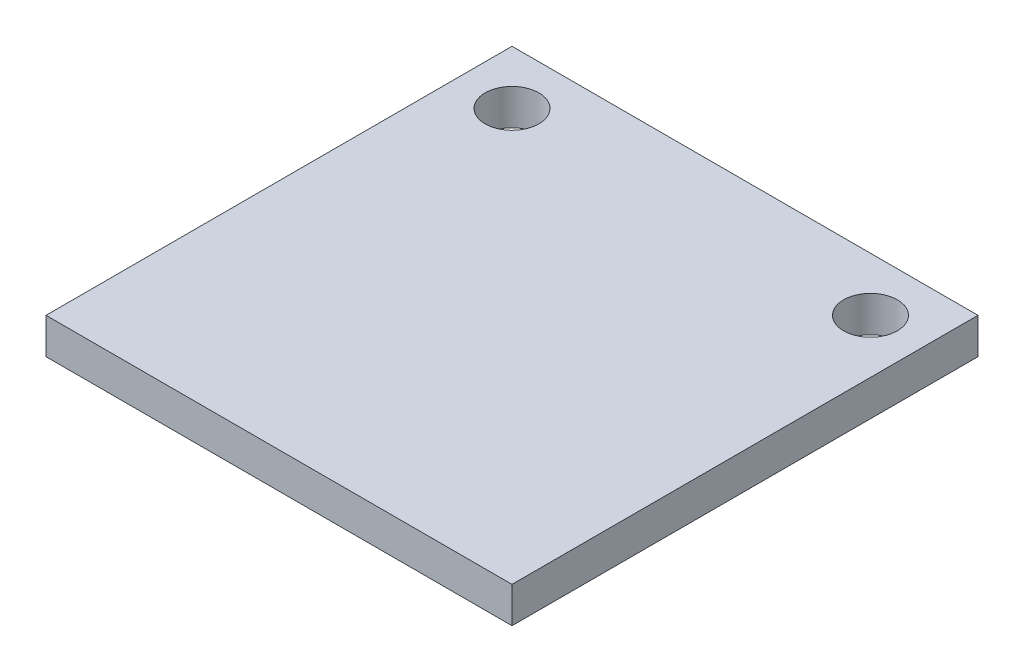
ISO-10303-21;
HEADER;
FILE_DESCRIPTION(('STEP AP214'),'2;1');
FILE_NAME('part.step','',(''),(''),'','','');
FILE_SCHEMA(('AUTOMOTIVE_DESIGN { 1 0 10303 214 1 1 1 1 }'));
ENDSEC;
DATA;
#1=APPLICATION_CONTEXT('core data for automotive mechanical design processes');
#2=APPLICATION_PROTOCOL_DEFINITION('international standard','automotive_design',2000,#1);
#3=PRODUCT_CONTEXT('',#1,'mechanical');
#4=PRODUCT('Part','Part','',(#3));
#5=PRODUCT_RELATED_PRODUCT_CATEGORY('part','',(#4));
#6=PRODUCT_DEFINITION_FORMATION('','',#4);
#7=PRODUCT_DEFINITION_CONTEXT('part definition',#1,'design');
#8=PRODUCT_DEFINITION('design','',#6,#7);
#9=PRODUCT_DEFINITION_SHAPE('','',#8);
#10=(LENGTH_UNIT() NAMED_UNIT(*) SI_UNIT(.MILLI.,.METRE.));
#11=(NAMED_UNIT(*) PLANE_ANGLE_UNIT() SI_UNIT($,.RADIAN.));
#12=(NAMED_UNIT(*) SI_UNIT($,.STERADIAN.) SOLID_ANGLE_UNIT());
#13=UNCERTAINTY_MEASURE_WITH_UNIT(LENGTH_MEASURE(1.E-05),#10,'distance_accuracy_value','');
#14=(GEOMETRIC_REPRESENTATION_CONTEXT(3) GLOBAL_UNCERTAINTY_ASSIGNED_CONTEXT((#13)) GLOBAL_UNIT_ASSIGNED_CONTEXT((#10,
#11,#12)) REPRESENTATION_CONTEXT('',''));
#15=CARTESIAN_POINT('',(0.,0.,0.));
#16=DIRECTION('',(0.,0.,1.));
#17=DIRECTION('',(1.,0.,0.));
#18=AXIS2_PLACEMENT_3D('',#15,#16,#17);
#19=CARTESIAN_POINT('',(0.,2.,0.));
#20=DIRECTION('',(0.,-1.,0.));
#21=DIRECTION('',(0.,0.,-1.));
#22=AXIS2_PLACEMENT_3D('',#19,#20,#21);
#23=PLANE('',#22);
#24=DIRECTION('',(0.,0.,-1.));
#25=VECTOR('',#24,1.);
#26=CARTESIAN_POINT('',(13.,2.,13.));
#27=LINE('',#26,#25);
#28=CARTESIAN_POINT('',(13.,2.,13.));
#29=VERTEX_POINT('',#28);
#30=CARTESIAN_POINT('',(13.,2.,-13.));
#31=VERTEX_POINT('',#30);
#32=EDGE_CURVE('E87',#29,#31,#27,.T.);
#33=ORIENTED_EDGE('',*,*,#32,.T.);
#34=DIRECTION('',(-1.,0.,0.));
#35=VECTOR('',#34,1.);
#36=CARTESIAN_POINT('',(-13.,2.,-13.));
#37=LINE('',#36,#35);
#38=CARTESIAN_POINT('',(-13.,2.,-13.));
#39=VERTEX_POINT('',#38);
#40=EDGE_CURVE('E82',#31,#39,#37,.T.);
#41=ORIENTED_EDGE('',*,*,#40,.T.);
#42=DIRECTION('',(0.,0.,1.));
#43=VECTOR('',#42,1.);
#44=CARTESIAN_POINT('',(-13.,2.,13.));
#45=LINE('',#44,#43);
#46=CARTESIAN_POINT('',(-13.,2.,13.));
#47=VERTEX_POINT('',#46);
#48=EDGE_CURVE('E85',#39,#47,#45,.T.);
#49=ORIENTED_EDGE('',*,*,#48,.T.);
#50=DIRECTION('',(1.,0.,0.));
#51=VECTOR('',#50,1.);
#52=CARTESIAN_POINT('',(-13.,2.,13.));
#53=LINE('',#52,#51);
#54=EDGE_CURVE('E52',#47,#29,#53,.T.);
#55=ORIENTED_EDGE('',*,*,#54,.T.);
#56=EDGE_LOOP('',(#33,#41,#49,#55));
#57=FACE_BOUND('',#56,.T.);
#58=CARTESIAN_POINT('',(-10.,2.,-10.));
#59=DIRECTION('',(0.,1.,0.));
#60=DIRECTION('',(0.,0.,1.));
#61=AXIS2_PLACEMENT_3D('',#58,#59,#60);
#62=CIRCLE('',#61,1.5);
#63=CARTESIAN_POINT('',(-10.,2.,-8.5));
#64=VERTEX_POINT('',#63);
#65=EDGE_CURVE('E102',#64,#64,#62,.T.);
#66=ORIENTED_EDGE('',*,*,#65,.F.);
#67=EDGE_LOOP('',(#66));
#68=FACE_BOUND('',#67,.T.);
#69=CARTESIAN_POINT('',(9.99999999999999,2.,-10.));
#70=DIRECTION('',(0.,1.,0.));
#71=DIRECTION('',(0.,0.,1.));
#72=AXIS2_PLACEMENT_3D('',#69,#70,#71);
#73=CIRCLE('',#72,1.5);
#74=CARTESIAN_POINT('',(9.99999999999999,2.,-8.49999999999999));
#75=VERTEX_POINT('',#74);
#76=EDGE_CURVE('E117',#75,#75,#73,.T.);
#77=ORIENTED_EDGE('',*,*,#76,.F.);
#78=EDGE_LOOP('',(#77));
#79=FACE_BOUND('',#78,.T.);
#80=ADVANCED_FACE('F35',(#57,#68,#79),#23,.F.);
#81=CARTESIAN_POINT('',(0.,0.,0.));
#82=DIRECTION('',(0.,-1.,0.));
#83=DIRECTION('',(0.,0.,-1.));
#84=AXIS2_PLACEMENT_3D('',#81,#82,#83);
#85=PLANE('',#84);
#86=CARTESIAN_POINT('',(-10.,0.,-10.));
#87=DIRECTION('',(0.,1.,0.));
#88=DIRECTION('',(0.,0.,1.));
#89=AXIS2_PLACEMENT_3D('',#86,#87,#88);
#90=CIRCLE('',#89,1.5);
#91=CARTESIAN_POINT('',(-10.,0.,-8.5));
#92=VERTEX_POINT('',#91);
#93=EDGE_CURVE('E114',#92,#92,#90,.T.);
#94=ORIENTED_EDGE('',*,*,#93,.T.);
#95=EDGE_LOOP('',(#94));
#96=FACE_BOUND('',#95,.T.);
#97=DIRECTION('',(0.,0.,-1.));
#98=VECTOR('',#97,1.);
#99=CARTESIAN_POINT('',(13.,0.,13.));
#100=LINE('',#99,#98);
#101=CARTESIAN_POINT('',(13.,0.,13.));
#102=VERTEX_POINT('',#101);
#103=CARTESIAN_POINT('',(13.,0.,-13.));
#104=VERTEX_POINT('',#103);
#105=EDGE_CURVE('E99',#102,#104,#100,.T.);
#106=ORIENTED_EDGE('',*,*,#105,.F.);
#107=DIRECTION('',(1.,0.,0.));
#108=VECTOR('',#107,1.);
#109=CARTESIAN_POINT('',(-13.,0.,13.));
#110=LINE('',#109,#108);
#111=CARTESIAN_POINT('',(-13.,0.,13.));
#112=VERTEX_POINT('',#111);
#113=EDGE_CURVE('E75',#112,#102,#110,.T.);
#114=ORIENTED_EDGE('',*,*,#113,.F.);
#115=DIRECTION('',(0.,0.,1.));
#116=VECTOR('',#115,1.);
#117=CARTESIAN_POINT('',(-13.,0.,13.));
#118=LINE('',#117,#116);
#119=CARTESIAN_POINT('',(-13.,0.,-13.));
#120=VERTEX_POINT('',#119);
#121=EDGE_CURVE('E69',#120,#112,#118,.T.);
#122=ORIENTED_EDGE('',*,*,#121,.F.);
#123=DIRECTION('',(-1.,0.,0.));
#124=VECTOR('',#123,1.);
#125=CARTESIAN_POINT('',(-13.,0.,-13.));
#126=LINE('',#125,#124);
#127=EDGE_CURVE('E91',#104,#120,#126,.T.);
#128=ORIENTED_EDGE('',*,*,#127,.F.);
#129=EDGE_LOOP('',(#106,#114,#122,#128));
#130=FACE_BOUND('',#129,.T.);
#131=CARTESIAN_POINT('',(9.99999999999999,0.,-10.));
#132=DIRECTION('',(0.,1.,0.));
#133=DIRECTION('',(0.,0.,1.));
#134=AXIS2_PLACEMENT_3D('',#131,#132,#133);
#135=CIRCLE('',#134,1.5);
#136=CARTESIAN_POINT('',(9.99999999999999,0.,-8.49999999999999));
#137=VERTEX_POINT('',#136);
#138=EDGE_CURVE('E120',#137,#137,#135,.T.);
#139=ORIENTED_EDGE('',*,*,#138,.T.);
#140=EDGE_LOOP('',(#139));
#141=FACE_BOUND('',#140,.T.);
#142=ADVANCED_FACE('F110',(#96,#130,#141),#85,.T.);
#143=CARTESIAN_POINT('',(13.,2.,13.));
#144=DIRECTION('',(-1.,0.,0.));
#145=DIRECTION('',(0.,0.,1.));
#146=AXIS2_PLACEMENT_3D('',#143,#144,#145);
#147=PLANE('',#146);
#148=ORIENTED_EDGE('',*,*,#105,.T.);
#149=DIRECTION('',(0.,-1.,0.));
#150=VECTOR('',#149,1.);
#151=CARTESIAN_POINT('',(13.,2.,-13.));
#152=LINE('',#151,#150);
#153=EDGE_CURVE('E11',#31,#104,#152,.T.);
#154=ORIENTED_EDGE('',*,*,#153,.F.);
#155=ORIENTED_EDGE('',*,*,#32,.F.);
#156=DIRECTION('',(0.,-1.,0.));
#157=VECTOR('',#156,1.);
#158=CARTESIAN_POINT('',(13.,2.,13.));
#159=LINE('',#158,#157);
#160=EDGE_CURVE('E95',#29,#102,#159,.T.);
#161=ORIENTED_EDGE('',*,*,#160,.T.);
#162=EDGE_LOOP('',(#148,#154,#155,#161));
#163=FACE_BOUND('',#162,.T.);
#164=ADVANCED_FACE('F37',(#163),#147,.F.);
#165=CARTESIAN_POINT('',(-13.,2.,-13.));
#166=DIRECTION('',(0.,0.,1.));
#167=DIRECTION('',(1.,0.,0.));
#168=AXIS2_PLACEMENT_3D('',#165,#166,#167);
#169=PLANE('',#168);
#170=ORIENTED_EDGE('',*,*,#127,.T.);
#171=DIRECTION('',(0.,-1.,0.));
#172=VECTOR('',#171,1.);
#173=CARTESIAN_POINT('',(-13.,2.,-13.));
#174=LINE('',#173,#172);
#175=EDGE_CURVE('E44',#39,#120,#174,.T.);
#176=ORIENTED_EDGE('',*,*,#175,.F.);
#177=ORIENTED_EDGE('',*,*,#40,.F.);
#178=ORIENTED_EDGE('',*,*,#153,.T.);
#179=EDGE_LOOP('',(#170,#176,#177,#178));
#180=FACE_BOUND('',#179,.T.);
#181=ADVANCED_FACE('F90',(#180),#169,.F.);
#182=CARTESIAN_POINT('',(-13.,2.,13.));
#183=DIRECTION('',(1.,0.,0.));
#184=DIRECTION('',(0.,0.,-1.));
#185=AXIS2_PLACEMENT_3D('',#182,#183,#184);
#186=PLANE('',#185);
#187=ORIENTED_EDGE('',*,*,#121,.T.);
#188=DIRECTION('',(0.,-1.,0.));
#189=VECTOR('',#188,1.);
#190=CARTESIAN_POINT('',(-13.,2.,13.));
#191=LINE('',#190,#189);
#192=EDGE_CURVE('E92',#47,#112,#191,.T.);
#193=ORIENTED_EDGE('',*,*,#192,.F.);
#194=ORIENTED_EDGE('',*,*,#48,.F.);
#195=ORIENTED_EDGE('',*,*,#175,.T.);
#196=EDGE_LOOP('',(#187,#193,#194,#195));
#197=FACE_BOUND('',#196,.T.);
#198=ADVANCED_FACE('F93',(#197),#186,.F.);
#199=CARTESIAN_POINT('',(-13.,2.,13.));
#200=DIRECTION('',(0.,0.,-1.));
#201=DIRECTION('',(-1.,0.,0.));
#202=AXIS2_PLACEMENT_3D('',#199,#200,#201);
#203=PLANE('',#202);
#204=ORIENTED_EDGE('',*,*,#113,.T.);
#205=ORIENTED_EDGE('',*,*,#160,.F.);
#206=ORIENTED_EDGE('',*,*,#54,.F.);
#207=ORIENTED_EDGE('',*,*,#192,.T.);
#208=EDGE_LOOP('',(#204,#205,#206,#207));
#209=FACE_BOUND('',#208,.T.);
#210=ADVANCED_FACE('F107',(#209),#203,.F.);
#211=CARTESIAN_POINT('',(-10.,2.,-10.));
#212=DIRECTION('',(0.,-1.,0.));
#213=DIRECTION('',(0.,0.,-1.));
#214=AXIS2_PLACEMENT_3D('',#211,#212,#213);
#215=CYLINDRICAL_SURFACE('',#214,1.5);
#216=ORIENTED_EDGE('',*,*,#65,.T.);
#217=EDGE_LOOP('',(#216));
#218=FACE_BOUND('',#217,.T.);
#219=ORIENTED_EDGE('',*,*,#93,.F.);
#220=EDGE_LOOP('',(#219));
#221=FACE_BOUND('',#220,.T.);
#222=ADVANCED_FACE('F137',(#218,#221),#215,.F.);
#223=CARTESIAN_POINT('',(9.99999999999999,2.,-10.));
#224=DIRECTION('',(0.,-1.,0.));
#225=DIRECTION('',(0.,0.,-1.));
#226=AXIS2_PLACEMENT_3D('',#223,#224,#225);
#227=CYLINDRICAL_SURFACE('',#226,1.5);
#228=ORIENTED_EDGE('',*,*,#76,.T.);
#229=EDGE_LOOP('',(#228));
#230=FACE_BOUND('',#229,.T.);
#231=ORIENTED_EDGE('',*,*,#138,.F.);
#232=EDGE_LOOP('',(#231));
#233=FACE_BOUND('',#232,.T.);
#234=ADVANCED_FACE('F126',(#230,#233),#227,.F.);
#235=CLOSED_SHELL('',(#80,#142,#164,#181,#198,#210,#222,#234));
#236=MANIFOLD_SOLID_BREP('B2',#235);
#237=ADVANCED_BREP_SHAPE_REPRESENTATION('',(#18,#236),#14);
#238=SHAPE_DEFINITION_REPRESENTATION(#9,#237);
ENDSEC;
END-ISO-10303-21;
